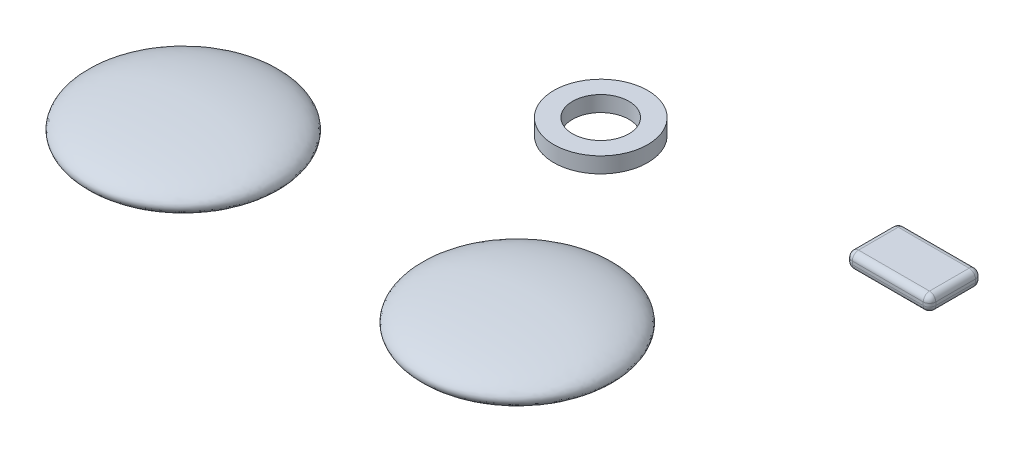
ISO-10303-21;
HEADER;
FILE_DESCRIPTION(('STEP AP214'),'2;1');
FILE_NAME('part.step','',(''),(''),'','','');
FILE_SCHEMA(('AUTOMOTIVE_DESIGN { 1 0 10303 214 1 1 1 1 }'));
ENDSEC;
DATA;
#1=APPLICATION_CONTEXT('core data for automotive mechanical design processes');
#2=APPLICATION_PROTOCOL_DEFINITION('international standard','automotive_design',2000,#1);
#3=PRODUCT_CONTEXT('',#1,'mechanical');
#4=PRODUCT('Part','Part','',(#3));
#5=PRODUCT_RELATED_PRODUCT_CATEGORY('part','',(#4));
#6=PRODUCT_DEFINITION_FORMATION('','',#4);
#7=PRODUCT_DEFINITION_CONTEXT('part definition',#1,'design');
#8=PRODUCT_DEFINITION('design','',#6,#7);
#9=PRODUCT_DEFINITION_SHAPE('','',#8);
#10=(LENGTH_UNIT() NAMED_UNIT(*) SI_UNIT(.MILLI.,.METRE.));
#11=(NAMED_UNIT(*) PLANE_ANGLE_UNIT() SI_UNIT($,.RADIAN.));
#12=(NAMED_UNIT(*) SI_UNIT($,.STERADIAN.) SOLID_ANGLE_UNIT());
#13=UNCERTAINTY_MEASURE_WITH_UNIT(LENGTH_MEASURE(1.E-05),#10,'distance_accuracy_value','');
#14=(GEOMETRIC_REPRESENTATION_CONTEXT(3) GLOBAL_UNCERTAINTY_ASSIGNED_CONTEXT((#13)) GLOBAL_UNIT_ASSIGNED_CONTEXT((#10,
#11,#12)) REPRESENTATION_CONTEXT('',''));
#15=CARTESIAN_POINT('',(0.,0.,0.));
#16=DIRECTION('',(0.,0.,1.));
#17=DIRECTION('',(1.,0.,0.));
#18=AXIS2_PLACEMENT_3D('',#15,#16,#17);
#19=CARTESIAN_POINT('',(-16.,-50.,105.7));
#20=CARTESIAN_POINT('',(-6.7,-50.,105.7));
#21=CARTESIAN_POINT('',(-6.7,-50.,115.));
#22=CARTESIAN_POINT('',(-6.7,-50.,124.3));
#23=CARTESIAN_POINT('',(-16.,-50.,124.3));
#24=CARTESIAN_POINT('',(-16.,-50.,105.7));
#25=CARTESIAN_POINT('',(-6.7,-46.189488223348,105.7));
#26=CARTESIAN_POINT('',(-6.7,-46.189488223348,115.));
#27=CARTESIAN_POINT('',(-6.7,-46.189488223348,124.3));
#28=CARTESIAN_POINT('',(-16.,-50.,124.3));
#29=CARTESIAN_POINT('',(-16.,-50.,105.7));
#30=CARTESIAN_POINT('',(-20.65,-48.094744111674,105.7));
#31=CARTESIAN_POINT('',(-20.65,-48.094744111674,115.));
#32=CARTESIAN_POINT('',(-20.65,-48.094744111674,124.3));
#33=CARTESIAN_POINT('',(-16.,-50.,124.3));
#34=CARTESIAN_POINT('',(-16.,-50.,105.7));
#35=CARTESIAN_POINT('',(-34.6,-50.,105.7));
#36=CARTESIAN_POINT('',(-34.6,-50.,115.));
#37=CARTESIAN_POINT('',(-34.6,-50.,124.3));
#38=CARTESIAN_POINT('',(-16.,-50.,124.3));
#39=CARTESIAN_POINT('',(-16.,-50.,105.7));
#40=CARTESIAN_POINT('',(-20.65,-51.905255888326,105.7));
#41=CARTESIAN_POINT('',(-20.65,-51.905255888326,115.));
#42=CARTESIAN_POINT('',(-20.65,-51.905255888326,124.3));
#43=CARTESIAN_POINT('',(-16.,-50.,124.3));
#44=CARTESIAN_POINT('',(-16.,-50.,105.7));
#45=CARTESIAN_POINT('',(-6.7,-53.810511776652,105.7));
#46=CARTESIAN_POINT('',(-6.7,-53.810511776652,115.));
#47=CARTESIAN_POINT('',(-6.7,-53.810511776652,124.3));
#48=CARTESIAN_POINT('',(-16.,-50.,124.3));
#49=CARTESIAN_POINT('',(-16.,-50.,105.7));
#50=CARTESIAN_POINT('',(-6.7,-50.,105.7));
#51=CARTESIAN_POINT('',(-6.7,-50.,115.));
#52=CARTESIAN_POINT('',(-6.7,-50.,124.3));
#53=CARTESIAN_POINT('',(-16.,-50.,124.3));
#54=(BOUNDED_SURFACE() B_SPLINE_SURFACE(2,2,((#19,#20,#21,#22,#23),(#24,#25,#26,#27,#28),(#29,
#30,#31,#32,#33),(#34,#35,#36,#37,#38),(#39,#40,#41,#42,#43),(#44,#45,#46,#47,#48),(#49,#50,#51,
#52,#53)),.UNSPECIFIED.,.T.,.F.,.F.) B_SPLINE_SURFACE_WITH_KNOTS((3,2,2,3),(3,2,3),(0.,
2.094395102393,4.188790204786,6.28318530718),(-1.570796326795,0.,1.570796326795),
.UNSPECIFIED.) GEOMETRIC_REPRESENTATION_ITEM() RATIONAL_B_SPLINE_SURFACE(((1.,0.707106781187,1.,
0.707106781187,1.),(0.5,0.353553390593,0.5,0.353553390593,0.5),(1.,0.707106781187,1.,
0.707106781187,1.),(0.5,0.353553390593,0.5,0.353553390593,0.5),(1.,0.707106781187,1.,
0.707106781187,1.),(0.5,0.353553390593,0.5,0.353553390593,0.5),(1.,0.707106781187,1.,
0.707106781187,1.))) REPRESENTATION_ITEM('') SURFACE());
#55=CARTESIAN_POINT('',(-16.,-50.,124.3));
#56=VERTEX_POINT('',#55);
#57=VERTEX_LOOP('',#56);
#58=FACE_BOUND('',#57,.T.);
#59=CARTESIAN_POINT('',(-16.,-50.,105.7));
#60=VERTEX_POINT('',#59);
#61=VERTEX_LOOP('',#60);
#62=FACE_BOUND('',#61,.T.);
#63=ADVANCED_FACE('P0_F15',(#58,#62),#54,.T.);
#64=CLOSED_SHELL('',(#63));
#65=MANIFOLD_SOLID_BREP('P0_B1',#64);
#66=CARTESIAN_POINT('',(16.,-50.,105.7));
#67=CARTESIAN_POINT('',(25.3,-50.,105.7));
#68=CARTESIAN_POINT('',(25.3,-50.,115.));
#69=CARTESIAN_POINT('',(25.3,-50.,124.3));
#70=CARTESIAN_POINT('',(16.,-50.,124.3));
#71=CARTESIAN_POINT('',(16.,-50.,105.7));
#72=CARTESIAN_POINT('',(25.3,-46.189488223348,105.7));
#73=CARTESIAN_POINT('',(25.3,-46.189488223348,115.));
#74=CARTESIAN_POINT('',(25.3,-46.189488223348,124.3));
#75=CARTESIAN_POINT('',(16.,-50.,124.3));
#76=CARTESIAN_POINT('',(16.,-50.,105.7));
#77=CARTESIAN_POINT('',(11.35,-48.094744111674,105.7));
#78=CARTESIAN_POINT('',(11.35,-48.094744111674,115.));
#79=CARTESIAN_POINT('',(11.35,-48.094744111674,124.3));
#80=CARTESIAN_POINT('',(16.,-50.,124.3));
#81=CARTESIAN_POINT('',(16.,-50.,105.7));
#82=CARTESIAN_POINT('',(-2.6,-50.,105.7));
#83=CARTESIAN_POINT('',(-2.6,-50.,115.));
#84=CARTESIAN_POINT('',(-2.6,-50.,124.3));
#85=CARTESIAN_POINT('',(16.,-50.,124.3));
#86=CARTESIAN_POINT('',(16.,-50.,105.7));
#87=CARTESIAN_POINT('',(11.35,-51.905255888326,105.7));
#88=CARTESIAN_POINT('',(11.35,-51.905255888326,115.));
#89=CARTESIAN_POINT('',(11.35,-51.905255888326,124.3));
#90=CARTESIAN_POINT('',(16.,-50.,124.3));
#91=CARTESIAN_POINT('',(16.,-50.,105.7));
#92=CARTESIAN_POINT('',(25.3,-53.810511776652,105.7));
#93=CARTESIAN_POINT('',(25.3,-53.810511776652,115.));
#94=CARTESIAN_POINT('',(25.3,-53.810511776652,124.3));
#95=CARTESIAN_POINT('',(16.,-50.,124.3));
#96=CARTESIAN_POINT('',(16.,-50.,105.7));
#97=CARTESIAN_POINT('',(25.3,-50.,105.7));
#98=CARTESIAN_POINT('',(25.3,-50.,115.));
#99=CARTESIAN_POINT('',(25.3,-50.,124.3));
#100=CARTESIAN_POINT('',(16.,-50.,124.3));
#101=(BOUNDED_SURFACE() B_SPLINE_SURFACE(2,2,((#66,#67,#68,#69,#70),(#71,#72,#73,#74,#75),(#76,
#77,#78,#79,#80),(#81,#82,#83,#84,#85),(#86,#87,#88,#89,#90),(#91,#92,#93,#94,#95),(#96,#97,#98,
#99,#100)),.UNSPECIFIED.,.T.,.F.,.F.) B_SPLINE_SURFACE_WITH_KNOTS((3,2,2,3),(3,2,3),(0.,
2.094395102393,4.188790204786,6.28318530718),(-1.570796326795,0.,1.570796326795),
.UNSPECIFIED.) GEOMETRIC_REPRESENTATION_ITEM() RATIONAL_B_SPLINE_SURFACE(((1.,0.707106781187,1.,
0.707106781187,1.),(0.5,0.353553390593,0.5,0.353553390593,0.5),(1.,0.707106781187,1.,
0.707106781187,1.),(0.5,0.353553390593,0.5,0.353553390593,0.5),(1.,0.707106781187,1.,
0.707106781187,1.),(0.5,0.353553390593,0.5,0.353553390593,0.5),(1.,0.707106781187,1.,
0.707106781187,1.))) REPRESENTATION_ITEM('') SURFACE());
#102=CARTESIAN_POINT('',(16.,-50.,124.3));
#103=VERTEX_POINT('',#102);
#104=VERTEX_LOOP('',#103);
#105=FACE_BOUND('',#104,.T.);
#106=CARTESIAN_POINT('',(16.,-50.,105.7));
#107=VERTEX_POINT('',#106);
#108=VERTEX_LOOP('',#107);
#109=FACE_BOUND('',#108,.T.);
#110=ADVANCED_FACE('P1_F15',(#105,#109),#101,.T.);
#111=CLOSED_SHELL('',(#110));
#112=MANIFOLD_SOLID_BREP('P1_B1',#111);
#113=CARTESIAN_POINT('',(0.,-53.,91.));
#114=DIRECTION('',(0.,-1.,0.));
#115=DIRECTION('',(1.,0.,0.));
#116=AXIS2_PLACEMENT_3D('',#113,#114,#115);
#117=CYLINDRICAL_SURFACE('',#116,2.7);
#118=CARTESIAN_POINT('',(0.,-54.5,91.));
#119=DIRECTION('',(0.,-1.,0.));
#120=DIRECTION('',(1.,0.,0.));
#121=AXIS2_PLACEMENT_3D('',#118,#119,#120);
#122=CIRCLE('',#121,2.7);
#123=CARTESIAN_POINT('',(2.7,-54.5,91.));
#124=VERTEX_POINT('',#123);
#125=EDGE_CURVE('P2_E22',#124,#124,#122,.T.);
#126=ORIENTED_EDGE('',*,*,#125,.T.);
#127=EDGE_LOOP('',(#126));
#128=FACE_BOUND('',#127,.T.);
#129=CARTESIAN_POINT('',(0.,-53.,91.));
#130=DIRECTION('',(0.,-1.,0.));
#131=DIRECTION('',(1.,0.,0.));
#132=AXIS2_PLACEMENT_3D('',#129,#130,#131);
#133=CIRCLE('',#132,2.7);
#134=CARTESIAN_POINT('',(2.7,-53.,91.));
#135=VERTEX_POINT('',#134);
#136=EDGE_CURVE('P2_E10',#135,#135,#133,.T.);
#137=ORIENTED_EDGE('',*,*,#136,.F.);
#138=EDGE_LOOP('',(#137));
#139=FACE_BOUND('',#138,.T.);
#140=ADVANCED_FACE('P2_F15',(#128,#139),#117,.F.);
#141=CARTESIAN_POINT('',(0.,-53.,91.));
#142=DIRECTION('',(0.,-1.,0.));
#143=DIRECTION('',(0.,0.,-1.));
#144=AXIS2_PLACEMENT_3D('',#141,#142,#143);
#145=PLANE('',#144);
#146=ORIENTED_EDGE('',*,*,#136,.T.);
#147=EDGE_LOOP('',(#146));
#148=FACE_BOUND('',#147,.T.);
#149=CARTESIAN_POINT('',(0.,-53.,91.));
#150=DIRECTION('',(0.,-1.,0.));
#151=DIRECTION('',(1.,0.,0.));
#152=AXIS2_PLACEMENT_3D('',#149,#150,#151);
#153=CIRCLE('',#152,4.5);
#154=CARTESIAN_POINT('',(4.5,-53.,91.));
#155=VERTEX_POINT('',#154);
#156=EDGE_CURVE('P2_E30',#155,#155,#153,.T.);
#157=ORIENTED_EDGE('',*,*,#156,.F.);
#158=EDGE_LOOP('',(#157));
#159=FACE_BOUND('',#158,.T.);
#160=ADVANCED_FACE('P2_F52',(#148,#159),#145,.F.);
#161=CARTESIAN_POINT('',(0.,-54.5,91.));
#162=DIRECTION('',(0.,-1.,0.));
#163=DIRECTION('',(0.,0.,-1.));
#164=AXIS2_PLACEMENT_3D('',#161,#162,#163);
#165=PLANE('',#164);
#166=ORIENTED_EDGE('',*,*,#125,.F.);
#167=EDGE_LOOP('',(#166));
#168=FACE_BOUND('',#167,.T.);
#169=CARTESIAN_POINT('',(0.,-54.5,91.));
#170=DIRECTION('',(0.,-1.,0.));
#171=DIRECTION('',(1.,0.,0.));
#172=AXIS2_PLACEMENT_3D('',#169,#170,#171);
#173=CIRCLE('',#172,4.5);
#174=CARTESIAN_POINT('',(4.5,-54.5,91.));
#175=VERTEX_POINT('',#174);
#176=EDGE_CURVE('P2_E36',#175,#175,#173,.T.);
#177=ORIENTED_EDGE('',*,*,#176,.T.);
#178=EDGE_LOOP('',(#177));
#179=FACE_BOUND('',#178,.T.);
#180=ADVANCED_FACE('P2_F44',(#168,#179),#165,.T.);
#181=CARTESIAN_POINT('',(0.,-53.,91.));
#182=DIRECTION('',(0.,-1.,0.));
#183=DIRECTION('',(1.,0.,0.));
#184=AXIS2_PLACEMENT_3D('',#181,#182,#183);
#185=CYLINDRICAL_SURFACE('',#184,4.5);
#186=ORIENTED_EDGE('',*,*,#176,.F.);
#187=EDGE_LOOP('',(#186));
#188=FACE_BOUND('',#187,.T.);
#189=ORIENTED_EDGE('',*,*,#156,.T.);
#190=EDGE_LOOP('',(#189));
#191=FACE_BOUND('',#190,.T.);
#192=ADVANCED_FACE('P2_F46',(#188,#191),#185,.T.);
#193=CLOSED_SHELL('',(#140,#160,#180,#192));
#194=MANIFOLD_SOLID_BREP('P2_B1',#193);
#195=CARTESIAN_POINT('',(34.4,-49.35,93.9));
#196=DIRECTION('',(0.,-1.,0.));
#197=DIRECTION('',(1.,0.,0.));
#198=AXIS2_PLACEMENT_3D('',#195,#196,#197);
#199=SPHERICAL_SURFACE('',#198,0.6);
#200=CARTESIAN_POINT('',(34.4,-49.35,93.9));
#201=DIRECTION('',(0.,0.,-1.));
#202=DIRECTION('',(1.,0.,0.));
#203=AXIS2_PLACEMENT_3D('',#200,#201,#202);
#204=CIRCLE('',#203,0.6);
#205=CARTESIAN_POINT('',(34.4,-48.75,93.9));
#206=VERTEX_POINT('',#205);
#207=CARTESIAN_POINT('',(35.,-49.35,93.9));
#208=VERTEX_POINT('',#207);
#209=EDGE_CURVE('P3_E10',#206,#208,#204,.T.);
#210=ORIENTED_EDGE('',*,*,#209,.F.);
#211=CARTESIAN_POINT('',(34.4,-49.35,93.9));
#212=DIRECTION('',(1.,0.,0.));
#213=DIRECTION('',(0.,0.,1.));
#214=AXIS2_PLACEMENT_3D('',#211,#212,#213);
#215=CIRCLE('',#214,0.6);
#216=CARTESIAN_POINT('',(34.4,-49.35,94.5));
#217=VERTEX_POINT('',#216);
#218=EDGE_CURVE('P3_E103',#206,#217,#215,.T.);
#219=ORIENTED_EDGE('',*,*,#218,.T.);
#220=CARTESIAN_POINT('',(34.4,-49.35,93.9));
#221=DIRECTION('',(0.,-1.,0.));
#222=DIRECTION('',(1.,0.,0.));
#223=AXIS2_PLACEMENT_3D('',#220,#221,#222);
#224=CIRCLE('',#223,0.6);
#225=EDGE_CURVE('P3_E93',#208,#217,#224,.T.);
#226=ORIENTED_EDGE('',*,*,#225,.F.);
#227=EDGE_LOOP('',(#210,#219,#226));
#228=FACE_BOUND('',#227,.T.);
#229=ADVANCED_FACE('P3_F16',(#228),#199,.T.);
#230=CARTESIAN_POINT('',(34.4,-49.35,90.1));
#231=DIRECTION('',(0.,0.,1.));
#232=DIRECTION('',(1.,0.,0.));
#233=AXIS2_PLACEMENT_3D('',#230,#231,#232);
#234=SPHERICAL_SURFACE('',#233,0.6);
#235=CARTESIAN_POINT('',(34.4,-49.35,90.1));
#236=DIRECTION('',(0.,-1.,0.));
#237=DIRECTION('',(1.,0.,0.));
#238=AXIS2_PLACEMENT_3D('',#235,#236,#237);
#239=CIRCLE('',#238,0.6);
#240=CARTESIAN_POINT('',(34.4,-49.35,89.5));
#241=VERTEX_POINT('',#240);
#242=CARTESIAN_POINT('',(35.,-49.35,90.1));
#243=VERTEX_POINT('',#242);
#244=EDGE_CURVE('P3_E132',#241,#243,#239,.T.);
#245=ORIENTED_EDGE('',*,*,#244,.F.);
#246=CARTESIAN_POINT('',(34.4,-49.35,90.1));
#247=DIRECTION('',(1.,0.,0.));
#248=DIRECTION('',(0.,1.,0.));
#249=AXIS2_PLACEMENT_3D('',#246,#247,#248);
#250=CIRCLE('',#249,0.6);
#251=CARTESIAN_POINT('',(34.4,-48.75,90.1));
#252=VERTEX_POINT('',#251);
#253=EDGE_CURVE('P3_E113',#241,#252,#250,.T.);
#254=ORIENTED_EDGE('',*,*,#253,.T.);
#255=CARTESIAN_POINT('',(34.4,-49.35,90.1));
#256=DIRECTION('',(0.,0.,1.));
#257=DIRECTION('',(1.,0.,0.));
#258=AXIS2_PLACEMENT_3D('',#255,#256,#257);
#259=CIRCLE('',#258,0.6);
#260=EDGE_CURVE('P3_E25',#243,#252,#259,.T.);
#261=ORIENTED_EDGE('',*,*,#260,.F.);
#262=EDGE_LOOP('',(#245,#254,#261));
#263=FACE_BOUND('',#262,.T.);
#264=ADVANCED_FACE('P3_F406',(#263),#234,.T.);
#265=CARTESIAN_POINT('',(35.,-50.25,89.5));
#266=DIRECTION('',(1.,0.,0.));
#267=DIRECTION('',(0.,1.,0.));
#268=AXIS2_PLACEMENT_3D('',#265,#266,#267);
#269=PLANE('',#268);
#270=DIRECTION('',(0.,0.,1.));
#271=VECTOR('',#270,1.);
#272=CARTESIAN_POINT('',(35.,-49.65,89.5));
#273=LINE('',#272,#271);
#274=CARTESIAN_POINT('',(35.,-49.65,90.1));
#275=VERTEX_POINT('',#274);
#276=CARTESIAN_POINT('',(35.,-49.65,93.9));
#277=VERTEX_POINT('',#276);
#278=EDGE_CURVE('P3_E99',#275,#277,#273,.T.);
#279=ORIENTED_EDGE('',*,*,#278,.F.);
#280=DIRECTION('',(0.,1.,0.));
#281=VECTOR('',#280,1.);
#282=CARTESIAN_POINT('',(35.,-50.25,90.1));
#283=LINE('',#282,#281);
#284=EDGE_CURVE('P3_E136',#275,#243,#283,.T.);
#285=ORIENTED_EDGE('',*,*,#284,.T.);
#286=DIRECTION('',(0.,0.,1.));
#287=VECTOR('',#286,1.);
#288=CARTESIAN_POINT('',(35.,-49.35,89.5));
#289=LINE('',#288,#287);
#290=EDGE_CURVE('P3_E19',#243,#208,#289,.T.);
#291=ORIENTED_EDGE('',*,*,#290,.T.);
#292=DIRECTION('',(0.,1.,0.));
#293=VECTOR('',#292,1.);
#294=CARTESIAN_POINT('',(35.,-50.25,93.9));
#295=LINE('',#294,#293);
#296=EDGE_CURVE('P3_E84',#277,#208,#295,.T.);
#297=ORIENTED_EDGE('',*,*,#296,.F.);
#298=EDGE_LOOP('',(#279,#285,#291,#297));
#299=FACE_BOUND('',#298,.T.);
#300=ADVANCED_FACE('P3_F97',(#299),#269,.T.);
#301=CARTESIAN_POINT('',(34.4,-49.65,93.9));
#302=DIRECTION('',(0.,0.,-1.));
#303=DIRECTION('',(1.,0.,0.));
#304=AXIS2_PLACEMENT_3D('',#301,#302,#303);
#305=SPHERICAL_SURFACE('',#304,0.6);
#306=CARTESIAN_POINT('',(34.4,-49.65,93.9));
#307=DIRECTION('',(0.,1.,0.));
#308=DIRECTION('',(1.,0.,0.));
#309=AXIS2_PLACEMENT_3D('',#306,#307,#308);
#310=CIRCLE('',#309,0.6);
#311=CARTESIAN_POINT('',(34.4,-49.65,94.5));
#312=VERTEX_POINT('',#311);
#313=EDGE_CURVE('P3_E81',#312,#277,#310,.T.);
#314=ORIENTED_EDGE('',*,*,#313,.F.);
#315=CARTESIAN_POINT('',(34.4,-49.65,93.9));
#316=DIRECTION('',(1.,0.,0.));
#317=DIRECTION('',(0.,-1.,0.));
#318=AXIS2_PLACEMENT_3D('',#315,#316,#317);
#319=CIRCLE('',#318,0.6);
#320=CARTESIAN_POINT('',(34.4,-50.25,93.9));
#321=VERTEX_POINT('',#320);
#322=EDGE_CURVE('P3_E116',#312,#321,#319,.T.);
#323=ORIENTED_EDGE('',*,*,#322,.T.);
#324=CARTESIAN_POINT('',(34.4,-49.65,93.9));
#325=DIRECTION('',(0.,0.,-1.));
#326=DIRECTION('',(1.,0.,0.));
#327=AXIS2_PLACEMENT_3D('',#324,#325,#326);
#328=CIRCLE('',#327,0.6);
#329=EDGE_CURVE('P3_E109',#277,#321,#328,.T.);
#330=ORIENTED_EDGE('',*,*,#329,.F.);
#331=EDGE_LOOP('',(#314,#323,#330));
#332=FACE_BOUND('',#331,.T.);
#333=ADVANCED_FACE('P3_F115',(#332),#305,.T.);
#334=CARTESIAN_POINT('',(34.4,-49.65,90.1));
#335=DIRECTION('',(0.,0.,1.));
#336=DIRECTION('',(1.,0.,0.));
#337=AXIS2_PLACEMENT_3D('',#334,#335,#336);
#338=SPHERICAL_SURFACE('',#337,0.6);
#339=CARTESIAN_POINT('',(34.4,-49.65,90.1));
#340=DIRECTION('',(0.,0.,-1.));
#341=DIRECTION('',(1.,0.,0.));
#342=AXIS2_PLACEMENT_3D('',#339,#340,#341);
#343=CIRCLE('',#342,0.6);
#344=CARTESIAN_POINT('',(34.4,-50.25,90.1));
#345=VERTEX_POINT('',#344);
#346=EDGE_CURVE('P3_E111',#275,#345,#343,.T.);
#347=ORIENTED_EDGE('',*,*,#346,.T.);
#348=CARTESIAN_POINT('',(34.4,-49.65,90.1));
#349=DIRECTION('',(-1.,0.,0.));
#350=DIRECTION('',(0.,-1.,0.));
#351=AXIS2_PLACEMENT_3D('',#348,#349,#350);
#352=CIRCLE('',#351,0.6);
#353=CARTESIAN_POINT('',(34.4,-49.65,89.5));
#354=VERTEX_POINT('',#353);
#355=EDGE_CURVE('P3_E124',#354,#345,#352,.T.);
#356=ORIENTED_EDGE('',*,*,#355,.F.);
#357=CARTESIAN_POINT('',(34.4,-49.65,90.1));
#358=DIRECTION('',(0.,-1.,0.));
#359=DIRECTION('',(1.,0.,0.));
#360=AXIS2_PLACEMENT_3D('',#357,#358,#359);
#361=CIRCLE('',#360,0.6);
#362=EDGE_CURVE('P3_E128',#354,#275,#361,.T.);
#363=ORIENTED_EDGE('',*,*,#362,.T.);
#364=EDGE_LOOP('',(#347,#356,#363));
#365=FACE_BOUND('',#364,.T.);
#366=ADVANCED_FACE('P3_F427',(#365),#338,.T.);
#367=CARTESIAN_POINT('',(34.4,-49.35,89.5));
#368=DIRECTION('',(0.,0.,1.));
#369=DIRECTION('',(1.,0.,0.));
#370=AXIS2_PLACEMENT_3D('',#367,#368,#369);
#371=CYLINDRICAL_SURFACE('',#370,0.6);
#372=ORIENTED_EDGE('',*,*,#290,.F.);
#373=ORIENTED_EDGE('',*,*,#260,.T.);
#374=DIRECTION('',(0.,0.,1.));
#375=VECTOR('',#374,1.);
#376=CARTESIAN_POINT('',(34.4,-48.75,89.5));
#377=LINE('',#376,#375);
#378=EDGE_CURVE('P3_E181',#252,#206,#377,.T.);
#379=ORIENTED_EDGE('',*,*,#378,.T.);
#380=ORIENTED_EDGE('',*,*,#209,.T.);
#381=EDGE_LOOP('',(#372,#373,#379,#380));
#382=FACE_BOUND('',#381,.T.);
#383=ADVANCED_FACE('P3_F403',(#382),#371,.T.);
#384=CARTESIAN_POINT('',(34.4,-50.25,93.9));
#385=DIRECTION('',(0.,1.,0.));
#386=DIRECTION('',(1.,0.,0.));
#387=AXIS2_PLACEMENT_3D('',#384,#385,#386);
#388=CYLINDRICAL_SURFACE('',#387,0.6);
#389=ORIENTED_EDGE('',*,*,#296,.T.);
#390=ORIENTED_EDGE('',*,*,#225,.T.);
#391=DIRECTION('',(0.,1.,0.));
#392=VECTOR('',#391,1.);
#393=CARTESIAN_POINT('',(34.4,-50.25,94.5));
#394=LINE('',#393,#392);
#395=EDGE_CURVE('P3_E86',#312,#217,#394,.T.);
#396=ORIENTED_EDGE('',*,*,#395,.F.);
#397=ORIENTED_EDGE('',*,*,#313,.T.);
#398=EDGE_LOOP('',(#389,#390,#396,#397));
#399=FACE_BOUND('',#398,.T.);
#400=ADVANCED_FACE('P3_F83',(#399),#388,.T.);
#401=CARTESIAN_POINT('',(27.,-49.35,93.9));
#402=DIRECTION('',(1.,0.,0.));
#403=DIRECTION('',(0.,1.,0.));
#404=AXIS2_PLACEMENT_3D('',#401,#402,#403);
#405=CYLINDRICAL_SURFACE('',#404,0.6);
#406=CARTESIAN_POINT('',(27.6,-49.35,93.9));
#407=DIRECTION('',(1.,0.,0.));
#408=DIRECTION('',(0.,0.,1.));
#409=AXIS2_PLACEMENT_3D('',#406,#407,#408);
#410=CIRCLE('',#409,0.6);
#411=CARTESIAN_POINT('',(27.6,-48.75,93.9));
#412=VERTEX_POINT('',#411);
#413=CARTESIAN_POINT('',(27.6,-49.35,94.5));
#414=VERTEX_POINT('',#413);
#415=EDGE_CURVE('P3_E155',#412,#414,#410,.T.);
#416=ORIENTED_EDGE('',*,*,#415,.T.);
#417=DIRECTION('',(1.,0.,0.));
#418=VECTOR('',#417,1.);
#419=CARTESIAN_POINT('',(27.,-49.35,94.5));
#420=LINE('',#419,#418);
#421=EDGE_CURVE('P3_E151',#414,#217,#420,.T.);
#422=ORIENTED_EDGE('',*,*,#421,.T.);
#423=ORIENTED_EDGE('',*,*,#218,.F.);
#424=DIRECTION('',(1.,0.,0.));
#425=VECTOR('',#424,1.);
#426=CARTESIAN_POINT('',(27.,-48.75,93.9));
#427=LINE('',#426,#425);
#428=EDGE_CURVE('P3_E177',#412,#206,#427,.T.);
#429=ORIENTED_EDGE('',*,*,#428,.F.);
#430=EDGE_LOOP('',(#416,#422,#423,#429));
#431=FACE_BOUND('',#430,.T.);
#432=ADVANCED_FACE('P3_F152',(#431),#405,.T.);
#433=CARTESIAN_POINT('',(34.4,-50.25,90.1));
#434=DIRECTION('',(0.,1.,0.));
#435=DIRECTION('',(1.,0.,0.));
#436=AXIS2_PLACEMENT_3D('',#433,#434,#435);
#437=CYLINDRICAL_SURFACE('',#436,0.6);
#438=ORIENTED_EDGE('',*,*,#362,.F.);
#439=DIRECTION('',(0.,1.,0.));
#440=VECTOR('',#439,1.);
#441=CARTESIAN_POINT('',(34.4,-50.25,89.5));
#442=LINE('',#441,#440);
#443=EDGE_CURVE('P3_E233',#354,#241,#442,.T.);
#444=ORIENTED_EDGE('',*,*,#443,.T.);
#445=ORIENTED_EDGE('',*,*,#244,.T.);
#446=ORIENTED_EDGE('',*,*,#284,.F.);
#447=EDGE_LOOP('',(#438,#444,#445,#446));
#448=FACE_BOUND('',#447,.T.);
#449=ADVANCED_FACE('P3_F405',(#448),#437,.T.);
#450=CARTESIAN_POINT('',(27.,-49.35,90.1));
#451=DIRECTION('',(1.,0.,0.));
#452=DIRECTION('',(0.,1.,0.));
#453=AXIS2_PLACEMENT_3D('',#450,#451,#452);
#454=CYLINDRICAL_SURFACE('',#453,0.6);
#455=DIRECTION('',(1.,0.,0.));
#456=VECTOR('',#455,1.);
#457=CARTESIAN_POINT('',(27.,-48.75,90.1));
#458=LINE('',#457,#456);
#459=CARTESIAN_POINT('',(27.6,-48.75,90.1));
#460=VERTEX_POINT('',#459);
#461=EDGE_CURVE('P3_E184',#460,#252,#458,.T.);
#462=ORIENTED_EDGE('',*,*,#461,.T.);
#463=ORIENTED_EDGE('',*,*,#253,.F.);
#464=DIRECTION('',(1.,0.,0.));
#465=VECTOR('',#464,1.);
#466=CARTESIAN_POINT('',(27.,-49.35,89.5));
#467=LINE('',#466,#465);
#468=CARTESIAN_POINT('',(27.6,-49.35,89.5));
#469=VERTEX_POINT('',#468);
#470=EDGE_CURVE('P3_E232',#469,#241,#467,.T.);
#471=ORIENTED_EDGE('',*,*,#470,.F.);
#472=CARTESIAN_POINT('',(27.6,-49.35,90.1));
#473=DIRECTION('',(1.,0.,0.));
#474=DIRECTION('',(0.,1.,0.));
#475=AXIS2_PLACEMENT_3D('',#472,#473,#474);
#476=CIRCLE('',#475,0.6);
#477=EDGE_CURVE('P3_E169',#469,#460,#476,.T.);
#478=ORIENTED_EDGE('',*,*,#477,.T.);
#479=EDGE_LOOP('',(#462,#463,#471,#478));
#480=FACE_BOUND('',#479,.T.);
#481=ADVANCED_FACE('P3_F362',(#480),#454,.T.);
#482=CARTESIAN_POINT('',(34.4,-49.65,89.5));
#483=DIRECTION('',(0.,0.,1.));
#484=DIRECTION('',(1.,0.,0.));
#485=AXIS2_PLACEMENT_3D('',#482,#483,#484);
#486=CYLINDRICAL_SURFACE('',#485,0.6);
#487=ORIENTED_EDGE('',*,*,#329,.T.);
#488=DIRECTION('',(0.,0.,1.));
#489=VECTOR('',#488,1.);
#490=CARTESIAN_POINT('',(34.4,-50.25,89.5));
#491=LINE('',#490,#489);
#492=EDGE_CURVE('P3_E207',#345,#321,#491,.T.);
#493=ORIENTED_EDGE('',*,*,#492,.F.);
#494=ORIENTED_EDGE('',*,*,#346,.F.);
#495=ORIENTED_EDGE('',*,*,#278,.T.);
#496=EDGE_LOOP('',(#487,#493,#494,#495));
#497=FACE_BOUND('',#496,.T.);
#498=ADVANCED_FACE('P3_F107',(#497),#486,.T.);
#499=CARTESIAN_POINT('',(27.,-49.65,93.9));
#500=DIRECTION('',(1.,0.,0.));
#501=DIRECTION('',(0.,-1.,0.));
#502=AXIS2_PLACEMENT_3D('',#499,#500,#501);
#503=CYLINDRICAL_SURFACE('',#502,0.6);
#504=DIRECTION('',(1.,0.,0.));
#505=VECTOR('',#504,1.);
#506=CARTESIAN_POINT('',(27.,-50.25,93.9));
#507=LINE('',#506,#505);
#508=CARTESIAN_POINT('',(27.6,-50.25,93.9));
#509=VERTEX_POINT('',#508);
#510=EDGE_CURVE('P3_E211',#509,#321,#507,.T.);
#511=ORIENTED_EDGE('',*,*,#510,.T.);
#512=ORIENTED_EDGE('',*,*,#322,.F.);
#513=DIRECTION('',(1.,0.,0.));
#514=VECTOR('',#513,1.);
#515=CARTESIAN_POINT('',(27.,-49.65,94.5));
#516=LINE('',#515,#514);
#517=CARTESIAN_POINT('',(27.6,-49.65,94.5));
#518=VERTEX_POINT('',#517);
#519=EDGE_CURVE('P3_E163',#518,#312,#516,.T.);
#520=ORIENTED_EDGE('',*,*,#519,.F.);
#521=CARTESIAN_POINT('',(27.6,-49.65,93.9));
#522=DIRECTION('',(1.,0.,0.));
#523=DIRECTION('',(0.,-1.,0.));
#524=AXIS2_PLACEMENT_3D('',#521,#522,#523);
#525=CIRCLE('',#524,0.6);
#526=EDGE_CURVE('P3_E219',#518,#509,#525,.T.);
#527=ORIENTED_EDGE('',*,*,#526,.T.);
#528=EDGE_LOOP('',(#511,#512,#520,#527));
#529=FACE_BOUND('',#528,.T.);
#530=ADVANCED_FACE('P3_F324',(#529),#503,.T.);
#531=CARTESIAN_POINT('',(27.,-49.65,90.1));
#532=DIRECTION('',(1.,0.,0.));
#533=DIRECTION('',(0.,-1.,0.));
#534=AXIS2_PLACEMENT_3D('',#531,#532,#533);
#535=CYLINDRICAL_SURFACE('',#534,0.6);
#536=CARTESIAN_POINT('',(27.6,-49.65,90.1));
#537=DIRECTION('',(-1.,0.,0.));
#538=DIRECTION('',(0.,-1.,0.));
#539=AXIS2_PLACEMENT_3D('',#536,#537,#538);
#540=CIRCLE('',#539,0.6);
#541=CARTESIAN_POINT('',(27.6,-49.65,89.5));
#542=VERTEX_POINT('',#541);
#543=CARTESIAN_POINT('',(27.6,-50.25,90.1));
#544=VERTEX_POINT('',#543);
#545=EDGE_CURVE('P3_E225',#542,#544,#540,.T.);
#546=ORIENTED_EDGE('',*,*,#545,.F.);
#547=DIRECTION('',(1.,0.,0.));
#548=VECTOR('',#547,1.);
#549=CARTESIAN_POINT('',(27.,-49.65,89.5));
#550=LINE('',#549,#548);
#551=EDGE_CURVE('P3_E172',#542,#354,#550,.T.);
#552=ORIENTED_EDGE('',*,*,#551,.T.);
#553=ORIENTED_EDGE('',*,*,#355,.T.);
#554=DIRECTION('',(1.,0.,0.));
#555=VECTOR('',#554,1.);
#556=CARTESIAN_POINT('',(27.,-50.25,90.1));
#557=LINE('',#556,#555);
#558=EDGE_CURVE('P3_E199',#544,#345,#557,.T.);
#559=ORIENTED_EDGE('',*,*,#558,.F.);
#560=EDGE_LOOP('',(#546,#552,#553,#559));
#561=FACE_BOUND('',#560,.T.);
#562=ADVANCED_FACE('P3_F196',(#561),#535,.T.);
#563=CARTESIAN_POINT('',(27.,-48.75,89.5));
#564=DIRECTION('',(0.,1.,0.));
#565=DIRECTION('',(1.,0.,0.));
#566=AXIS2_PLACEMENT_3D('',#563,#564,#565);
#567=PLANE('',#566);
#568=DIRECTION('',(0.,0.,1.));
#569=VECTOR('',#568,1.);
#570=CARTESIAN_POINT('',(27.6,-48.75,89.5));
#571=LINE('',#570,#569);
#572=EDGE_CURVE('P3_E259',#460,#412,#571,.T.);
#573=ORIENTED_EDGE('',*,*,#572,.T.);
#574=ORIENTED_EDGE('',*,*,#428,.T.);
#575=ORIENTED_EDGE('',*,*,#378,.F.);
#576=ORIENTED_EDGE('',*,*,#461,.F.);
#577=EDGE_LOOP('',(#573,#574,#575,#576));
#578=FACE_BOUND('',#577,.T.);
#579=ADVANCED_FACE('P3_F402',(#578),#567,.T.);
#580=CARTESIAN_POINT('',(27.6,-49.35,93.9));
#581=DIRECTION('',(0.,-1.,0.));
#582=DIRECTION('',(-1.,0.,0.));
#583=AXIS2_PLACEMENT_3D('',#580,#581,#582);
#584=SPHERICAL_SURFACE('',#583,0.6);
#585=CARTESIAN_POINT('',(27.6,-49.35,93.9));
#586=DIRECTION('',(0.,1.,0.));
#587=DIRECTION('',(-1.,0.,0.));
#588=AXIS2_PLACEMENT_3D('',#585,#586,#587);
#589=CIRCLE('',#588,0.6);
#590=CARTESIAN_POINT('',(27.,-49.35,93.9));
#591=VERTEX_POINT('',#590);
#592=EDGE_CURVE('P3_E264',#591,#414,#589,.T.);
#593=ORIENTED_EDGE('',*,*,#592,.T.);
#594=ORIENTED_EDGE('',*,*,#415,.F.);
#595=CARTESIAN_POINT('',(27.6,-49.35,93.9));
#596=DIRECTION('',(0.,0.,1.));
#597=DIRECTION('',(-1.,0.,0.));
#598=AXIS2_PLACEMENT_3D('',#595,#596,#597);
#599=CIRCLE('',#598,0.6);
#600=EDGE_CURVE('P3_E260',#412,#591,#599,.T.);
#601=ORIENTED_EDGE('',*,*,#600,.T.);
#602=EDGE_LOOP('',(#593,#594,#601));
#603=FACE_BOUND('',#602,.T.);
#604=ADVANCED_FACE('P3_F494',(#603),#584,.T.);
#605=CARTESIAN_POINT('',(27.,-50.25,94.5));
#606=DIRECTION('',(0.,0.,1.));
#607=DIRECTION('',(1.,0.,0.));
#608=AXIS2_PLACEMENT_3D('',#605,#606,#607);
#609=PLANE('',#608);
#610=DIRECTION('',(0.,1.,0.));
#611=VECTOR('',#610,1.);
#612=CARTESIAN_POINT('',(27.6,-50.25,94.5));
#613=LINE('',#612,#611);
#614=EDGE_CURVE('P3_E267',#518,#414,#613,.T.);
#615=ORIENTED_EDGE('',*,*,#614,.F.);
#616=ORIENTED_EDGE('',*,*,#519,.T.);
#617=ORIENTED_EDGE('',*,*,#395,.T.);
#618=ORIENTED_EDGE('',*,*,#421,.F.);
#619=EDGE_LOOP('',(#615,#616,#617,#618));
#620=FACE_BOUND('',#619,.T.);
#621=ADVANCED_FACE('P3_F161',(#620),#609,.T.);
#622=CARTESIAN_POINT('',(27.6,-49.35,90.1));
#623=DIRECTION('',(0.,0.,1.));
#624=DIRECTION('',(-1.,0.,0.));
#625=AXIS2_PLACEMENT_3D('',#622,#623,#624);
#626=SPHERICAL_SURFACE('',#625,0.6);
#627=CARTESIAN_POINT('',(27.6,-49.35,90.1));
#628=DIRECTION('',(0.,0.,-1.));
#629=DIRECTION('',(-1.,0.,0.));
#630=AXIS2_PLACEMENT_3D('',#627,#628,#629);
#631=CIRCLE('',#630,0.6);
#632=CARTESIAN_POINT('',(27.,-49.35,90.1));
#633=VERTEX_POINT('',#632);
#634=EDGE_CURVE('P3_E255',#633,#460,#631,.T.);
#635=ORIENTED_EDGE('',*,*,#634,.T.);
#636=ORIENTED_EDGE('',*,*,#477,.F.);
#637=CARTESIAN_POINT('',(27.6,-49.35,90.1));
#638=DIRECTION('',(0.,1.,0.));
#639=DIRECTION('',(-1.,0.,0.));
#640=AXIS2_PLACEMENT_3D('',#637,#638,#639);
#641=CIRCLE('',#640,0.6);
#642=EDGE_CURVE('P3_E334',#469,#633,#641,.T.);
#643=ORIENTED_EDGE('',*,*,#642,.T.);
#644=EDGE_LOOP('',(#635,#636,#643));
#645=FACE_BOUND('',#644,.T.);
#646=ADVANCED_FACE('P3_F358',(#645),#626,.T.);
#647=CARTESIAN_POINT('',(27.,-50.25,89.5));
#648=DIRECTION('',(0.,0.,1.));
#649=DIRECTION('',(1.,0.,0.));
#650=AXIS2_PLACEMENT_3D('',#647,#648,#649);
#651=PLANE('',#650);
#652=ORIENTED_EDGE('',*,*,#470,.T.);
#653=ORIENTED_EDGE('',*,*,#443,.F.);
#654=ORIENTED_EDGE('',*,*,#551,.F.);
#655=DIRECTION('',(0.,1.,0.));
#656=VECTOR('',#655,1.);
#657=CARTESIAN_POINT('',(27.6,-50.25,89.5));
#658=LINE('',#657,#656);
#659=EDGE_CURVE('P3_E254',#542,#469,#658,.T.);
#660=ORIENTED_EDGE('',*,*,#659,.T.);
#661=EDGE_LOOP('',(#652,#653,#654,#660));
#662=FACE_BOUND('',#661,.T.);
#663=ADVANCED_FACE('P3_F350',(#662),#651,.F.);
#664=CARTESIAN_POINT('',(27.,-50.25,89.5));
#665=DIRECTION('',(0.,1.,0.));
#666=DIRECTION('',(1.,0.,0.));
#667=AXIS2_PLACEMENT_3D('',#664,#665,#666);
#668=PLANE('',#667);
#669=ORIENTED_EDGE('',*,*,#558,.T.);
#670=ORIENTED_EDGE('',*,*,#492,.T.);
#671=ORIENTED_EDGE('',*,*,#510,.F.);
#672=DIRECTION('',(0.,0.,1.));
#673=VECTOR('',#672,1.);
#674=CARTESIAN_POINT('',(27.6,-50.25,89.5));
#675=LINE('',#674,#673);
#676=EDGE_CURVE('P3_E216',#544,#509,#675,.T.);
#677=ORIENTED_EDGE('',*,*,#676,.F.);
#678=EDGE_LOOP('',(#669,#670,#671,#677));
#679=FACE_BOUND('',#678,.T.);
#680=ADVANCED_FACE('P3_F214',(#679),#668,.F.);
#681=CARTESIAN_POINT('',(27.6,-49.65,93.9));
#682=DIRECTION('',(0.,0.,-1.));
#683=DIRECTION('',(-1.,0.,0.));
#684=AXIS2_PLACEMENT_3D('',#681,#682,#683);
#685=SPHERICAL_SURFACE('',#684,0.6);
#686=CARTESIAN_POINT('',(27.6,-49.65,93.9));
#687=DIRECTION('',(0.,0.,1.));
#688=DIRECTION('',(-1.,0.,0.));
#689=AXIS2_PLACEMENT_3D('',#686,#687,#688);
#690=CIRCLE('',#689,0.6);
#691=CARTESIAN_POINT('',(27.,-49.65,93.9));
#692=VERTEX_POINT('',#691);
#693=EDGE_CURVE('P3_E328',#692,#509,#690,.T.);
#694=ORIENTED_EDGE('',*,*,#693,.T.);
#695=ORIENTED_EDGE('',*,*,#526,.F.);
#696=CARTESIAN_POINT('',(27.6,-49.65,93.9));
#697=DIRECTION('',(0.,-1.,0.));
#698=DIRECTION('',(-1.,0.,0.));
#699=AXIS2_PLACEMENT_3D('',#696,#697,#698);
#700=CIRCLE('',#699,0.6);
#701=EDGE_CURVE('P3_E249',#518,#692,#700,.T.);
#702=ORIENTED_EDGE('',*,*,#701,.T.);
#703=EDGE_LOOP('',(#694,#695,#702));
#704=FACE_BOUND('',#703,.T.);
#705=ADVANCED_FACE('P3_F329',(#704),#685,.T.);
#706=CARTESIAN_POINT('',(27.6,-49.65,90.1));
#707=DIRECTION('',(0.,0.,1.));
#708=DIRECTION('',(-1.,0.,0.));
#709=AXIS2_PLACEMENT_3D('',#706,#707,#708);
#710=SPHERICAL_SURFACE('',#709,0.6);
#711=CARTESIAN_POINT('',(27.6,-49.65,90.1));
#712=DIRECTION('',(0.,1.,0.));
#713=DIRECTION('',(-1.,0.,0.));
#714=AXIS2_PLACEMENT_3D('',#711,#712,#713);
#715=CIRCLE('',#714,0.6);
#716=CARTESIAN_POINT('',(27.,-49.65,90.1));
#717=VERTEX_POINT('',#716);
#718=EDGE_CURVE('P3_E251',#542,#717,#715,.T.);
#719=ORIENTED_EDGE('',*,*,#718,.F.);
#720=ORIENTED_EDGE('',*,*,#545,.T.);
#721=CARTESIAN_POINT('',(27.6,-49.65,90.1));
#722=DIRECTION('',(0.,0.,1.));
#723=DIRECTION('',(-1.,0.,0.));
#724=AXIS2_PLACEMENT_3D('',#721,#722,#723);
#725=CIRCLE('',#724,0.6);
#726=EDGE_CURVE('P3_E275',#717,#544,#725,.T.);
#727=ORIENTED_EDGE('',*,*,#726,.F.);
#728=EDGE_LOOP('',(#719,#720,#727));
#729=FACE_BOUND('',#728,.T.);
#730=ADVANCED_FACE('P3_F273',(#729),#710,.T.);
#731=CARTESIAN_POINT('',(27.6,-49.35,89.5));
#732=DIRECTION('',(0.,0.,1.));
#733=DIRECTION('',(-1.,0.,0.));
#734=AXIS2_PLACEMENT_3D('',#731,#732,#733);
#735=CYLINDRICAL_SURFACE('',#734,0.6);
#736=ORIENTED_EDGE('',*,*,#600,.F.);
#737=ORIENTED_EDGE('',*,*,#572,.F.);
#738=ORIENTED_EDGE('',*,*,#634,.F.);
#739=DIRECTION('',(0.,0.,1.));
#740=VECTOR('',#739,1.);
#741=CARTESIAN_POINT('',(27.,-49.35,89.5));
#742=LINE('',#741,#740);
#743=EDGE_CURVE('P3_E370',#633,#591,#742,.T.);
#744=ORIENTED_EDGE('',*,*,#743,.T.);
#745=EDGE_LOOP('',(#736,#737,#738,#744));
#746=FACE_BOUND('',#745,.T.);
#747=ADVANCED_FACE('P3_F401',(#746),#735,.T.);
#748=CARTESIAN_POINT('',(27.6,-50.25,93.9));
#749=DIRECTION('',(0.,1.,0.));
#750=DIRECTION('',(-1.,0.,0.));
#751=AXIS2_PLACEMENT_3D('',#748,#749,#750);
#752=CYLINDRICAL_SURFACE('',#751,0.6);
#753=ORIENTED_EDGE('',*,*,#701,.F.);
#754=ORIENTED_EDGE('',*,*,#614,.T.);
#755=ORIENTED_EDGE('',*,*,#592,.F.);
#756=DIRECTION('',(0.,1.,0.));
#757=VECTOR('',#756,1.);
#758=CARTESIAN_POINT('',(27.,-50.25,93.9));
#759=LINE('',#758,#757);
#760=EDGE_CURVE('P3_E368',#692,#591,#759,.T.);
#761=ORIENTED_EDGE('',*,*,#760,.F.);
#762=EDGE_LOOP('',(#753,#754,#755,#761));
#763=FACE_BOUND('',#762,.T.);
#764=ADVANCED_FACE('P3_F393',(#763),#752,.T.);
#765=CARTESIAN_POINT('',(27.6,-50.25,90.1));
#766=DIRECTION('',(0.,1.,0.));
#767=DIRECTION('',(-1.,0.,0.));
#768=AXIS2_PLACEMENT_3D('',#765,#766,#767);
#769=CYLINDRICAL_SURFACE('',#768,0.6);
#770=DIRECTION('',(0.,1.,0.));
#771=VECTOR('',#770,1.);
#772=CARTESIAN_POINT('',(27.,-50.25,90.1));
#773=LINE('',#772,#771);
#774=EDGE_CURVE('P3_E355',#717,#633,#773,.T.);
#775=ORIENTED_EDGE('',*,*,#774,.T.);
#776=ORIENTED_EDGE('',*,*,#642,.F.);
#777=ORIENTED_EDGE('',*,*,#659,.F.);
#778=ORIENTED_EDGE('',*,*,#718,.T.);
#779=EDGE_LOOP('',(#775,#776,#777,#778));
#780=FACE_BOUND('',#779,.T.);
#781=ADVANCED_FACE('P3_F353',(#780),#769,.T.);
#782=CARTESIAN_POINT('',(27.6,-49.65,89.5));
#783=DIRECTION('',(0.,0.,1.));
#784=DIRECTION('',(-1.,0.,0.));
#785=AXIS2_PLACEMENT_3D('',#782,#783,#784);
#786=CYLINDRICAL_SURFACE('',#785,0.6);
#787=DIRECTION('',(0.,0.,1.));
#788=VECTOR('',#787,1.);
#789=CARTESIAN_POINT('',(27.,-49.65,89.5));
#790=LINE('',#789,#788);
#791=EDGE_CURVE('P3_E341',#717,#692,#790,.T.);
#792=ORIENTED_EDGE('',*,*,#791,.F.);
#793=ORIENTED_EDGE('',*,*,#726,.T.);
#794=ORIENTED_EDGE('',*,*,#676,.T.);
#795=ORIENTED_EDGE('',*,*,#693,.F.);
#796=EDGE_LOOP('',(#792,#793,#794,#795));
#797=FACE_BOUND('',#796,.T.);
#798=ADVANCED_FACE('P3_F336',(#797),#786,.T.);
#799=CARTESIAN_POINT('',(27.,-50.25,89.5));
#800=DIRECTION('',(1.,0.,0.));
#801=DIRECTION('',(0.,1.,0.));
#802=AXIS2_PLACEMENT_3D('',#799,#800,#801);
#803=PLANE('',#802);
#804=ORIENTED_EDGE('',*,*,#760,.T.);
#805=ORIENTED_EDGE('',*,*,#743,.F.);
#806=ORIENTED_EDGE('',*,*,#774,.F.);
#807=ORIENTED_EDGE('',*,*,#791,.T.);
#808=EDGE_LOOP('',(#804,#805,#806,#807));
#809=FACE_BOUND('',#808,.T.);
#810=ADVANCED_FACE('P3_F398',(#809),#803,.F.);
#811=CLOSED_SHELL('',(#229,#264,#300,#333,#366,#383,#400,#432,#449,#481,#498,#530,#562,#579,
#604,#621,#646,#663,#680,#705,#730,#747,#764,#781,#798,#810));
#812=MANIFOLD_SOLID_BREP('P3_B1',#811);
#813=ADVANCED_BREP_SHAPE_REPRESENTATION('',(#18,#65,#112,#194,#812),#14);
#814=SHAPE_DEFINITION_REPRESENTATION(#9,#813);
ENDSEC;
END-ISO-10303-21;
